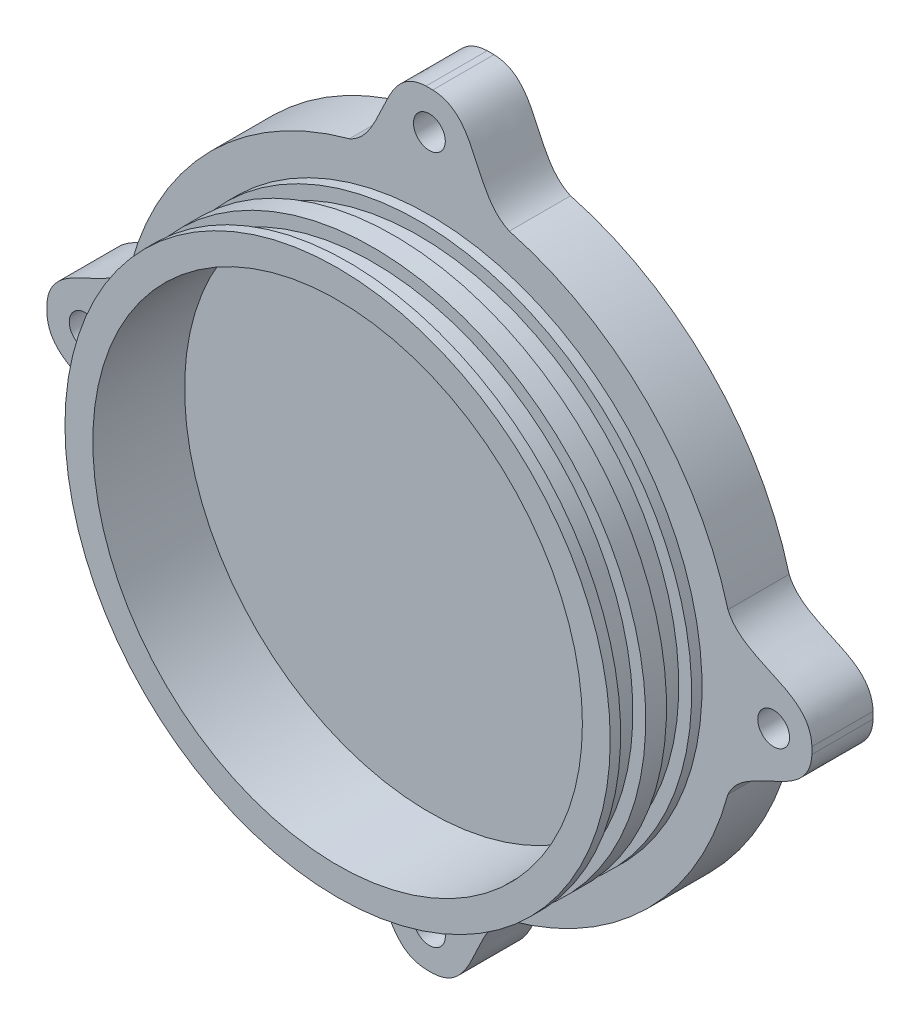
ISO-10303-21;
HEADER;
FILE_DESCRIPTION(('STEP AP214'),'2;1');
FILE_NAME('part.step','',(''),(''),'','','');
FILE_SCHEMA(('AUTOMOTIVE_DESIGN { 1 0 10303 214 1 1 1 1 }'));
ENDSEC;
DATA;
#1=APPLICATION_CONTEXT('core data for automotive mechanical design processes');
#2=APPLICATION_PROTOCOL_DEFINITION('international standard','automotive_design',2000,#1);
#3=PRODUCT_CONTEXT('',#1,'mechanical');
#4=PRODUCT('Part','Part','',(#3));
#5=PRODUCT_RELATED_PRODUCT_CATEGORY('part','',(#4));
#6=PRODUCT_DEFINITION_FORMATION('','',#4);
#7=PRODUCT_DEFINITION_CONTEXT('part definition',#1,'design');
#8=PRODUCT_DEFINITION('design','',#6,#7);
#9=PRODUCT_DEFINITION_SHAPE('','',#8);
#10=(LENGTH_UNIT() NAMED_UNIT(*) SI_UNIT(.MILLI.,.METRE.));
#11=(NAMED_UNIT(*) PLANE_ANGLE_UNIT() SI_UNIT($,.RADIAN.));
#12=(NAMED_UNIT(*) SI_UNIT($,.STERADIAN.) SOLID_ANGLE_UNIT());
#13=UNCERTAINTY_MEASURE_WITH_UNIT(LENGTH_MEASURE(1.E-05),#10,'distance_accuracy_value','');
#14=(GEOMETRIC_REPRESENTATION_CONTEXT(3) GLOBAL_UNCERTAINTY_ASSIGNED_CONTEXT((#13)) GLOBAL_UNIT_ASSIGNED_CONTEXT((#10,
#11,#12)) REPRESENTATION_CONTEXT('',''));
#15=CARTESIAN_POINT('',(0.,0.,0.));
#16=DIRECTION('',(0.,0.,1.));
#17=DIRECTION('',(1.,0.,0.));
#18=AXIS2_PLACEMENT_3D('',#15,#16,#17);
#19=CARTESIAN_POINT('',(0.,0.,-10.));
#20=DIRECTION('',(0.,0.,1.));
#21=DIRECTION('',(1.,0.,0.));
#22=AXIS2_PLACEMENT_3D('',#19,#20,#21);
#23=CYLINDRICAL_SURFACE('',#22,62.5);
#24=DIRECTION('',(0.,0.,1.));
#25=VECTOR('',#24,1.);
#26=CARTESIAN_POINT('',(0.554611570234708,-62.497539199605,-10.));
#27=LINE('',#26,#25);
#28=CARTESIAN_POINT('',(0.554611570234708,-62.497539199605,-10.));
#29=VERTEX_POINT('',#28);
#30=CARTESIAN_POINT('',(0.554611570234708,-62.497539199605,0.));
#31=VERTEX_POINT('',#30);
#32=EDGE_CURVE('E152',#29,#31,#27,.T.);
#33=ORIENTED_EDGE('',*,*,#32,.T.);
#34=CARTESIAN_POINT('',(0.,0.,0.));
#35=DIRECTION('',(0.,0.,-1.));
#36=DIRECTION('',(-1.,0.,0.));
#37=AXIS2_PLACEMENT_3D('',#34,#35,#36);
#38=CIRCLE('',#37,62.5);
#39=CARTESIAN_POINT('',(-0.554611570234827,-62.497539199605,0.));
#40=VERTEX_POINT('',#39);
#41=EDGE_CURVE('E190',#31,#40,#38,.T.);
#42=ORIENTED_EDGE('',*,*,#41,.T.);
#43=DIRECTION('',(0.,0.,1.));
#44=VECTOR('',#43,1.);
#45=CARTESIAN_POINT('',(-0.554611570234827,-62.497539199605,-10.));
#46=LINE('',#45,#44);
#47=CARTESIAN_POINT('',(-0.554611570234827,-62.497539199605,-10.));
#48=VERTEX_POINT('',#47);
#49=EDGE_CURVE('E61',#48,#40,#46,.T.);
#50=ORIENTED_EDGE('',*,*,#49,.F.);
#51=CARTESIAN_POINT('',(0.,0.,-10.));
#52=DIRECTION('',(0.,0.,-1.));
#53=DIRECTION('',(-1.,0.,0.));
#54=AXIS2_PLACEMENT_3D('',#51,#52,#53);
#55=CIRCLE('',#54,62.5);
#56=EDGE_CURVE('E172',#29,#48,#55,.T.);
#57=ORIENTED_EDGE('',*,*,#56,.F.);
#58=EDGE_LOOP('',(#33,#42,#50,#57));
#59=FACE_BOUND('',#58,.T.);
#60=ADVANCED_FACE('F36',(#59),#23,.T.);
#61=DIRECTION('',(0.,0.,1.));
#62=VECTOR('',#61,1.);
#63=CARTESIAN_POINT('',(-62.497539199605,-0.554611570234899,-10.));
#64=LINE('',#63,#62);
#65=CARTESIAN_POINT('',(-62.497539199605,-0.554611570234899,-10.));
#66=VERTEX_POINT('',#65);
#67=CARTESIAN_POINT('',(-62.497539199605,-0.554611570234899,0.));
#68=VERTEX_POINT('',#67);
#69=EDGE_CURVE('E742',#66,#68,#64,.T.);
#70=ORIENTED_EDGE('',*,*,#69,.T.);
#71=CARTESIAN_POINT('',(-62.497539199605,0.554611570235492,0.));
#72=VERTEX_POINT('',#71);
#73=EDGE_CURVE('E250',#68,#72,#38,.T.);
#74=ORIENTED_EDGE('',*,*,#73,.T.);
#75=DIRECTION('',(0.,0.,1.));
#76=VECTOR('',#75,1.);
#77=CARTESIAN_POINT('',(-62.497539199605,0.554611570235492,-10.));
#78=LINE('',#77,#76);
#79=CARTESIAN_POINT('',(-62.497539199605,0.554611570235492,-10.));
#80=VERTEX_POINT('',#79);
#81=EDGE_CURVE('E53',#80,#72,#78,.T.);
#82=ORIENTED_EDGE('',*,*,#81,.F.);
#83=EDGE_CURVE('E178',#66,#80,#55,.T.);
#84=ORIENTED_EDGE('',*,*,#83,.F.);
#85=EDGE_LOOP('',(#70,#74,#82,#84));
#86=FACE_BOUND('',#85,.T.);
#87=ADVANCED_FACE('F280',(#86),#23,.T.);
#88=DIRECTION('',(0.,0.,1.));
#89=VECTOR('',#88,1.);
#90=CARTESIAN_POINT('',(-0.554611570233609,62.497539199605,-10.));
#91=LINE('',#90,#89);
#92=CARTESIAN_POINT('',(-0.554611570233609,62.497539199605,-10.));
#93=VERTEX_POINT('',#92);
#94=CARTESIAN_POINT('',(-0.554611570233609,62.497539199605,0.));
#95=VERTEX_POINT('',#94);
#96=EDGE_CURVE('E304',#93,#95,#91,.T.);
#97=ORIENTED_EDGE('',*,*,#96,.T.);
#98=CARTESIAN_POINT('',(0.554611570235184,62.497539199605,0.));
#99=VERTEX_POINT('',#98);
#100=EDGE_CURVE('E191',#95,#99,#38,.T.);
#101=ORIENTED_EDGE('',*,*,#100,.T.);
#102=DIRECTION('',(0.,0.,1.));
#103=VECTOR('',#102,1.);
#104=CARTESIAN_POINT('',(0.554611570235183,62.497539199605,-10.));
#105=LINE('',#104,#103);
#106=CARTESIAN_POINT('',(0.554611570235183,62.497539199605,-10.));
#107=VERTEX_POINT('',#106);
#108=EDGE_CURVE('E217',#107,#99,#105,.T.);
#109=ORIENTED_EDGE('',*,*,#108,.F.);
#110=EDGE_CURVE('E181',#93,#107,#55,.T.);
#111=ORIENTED_EDGE('',*,*,#110,.F.);
#112=EDGE_LOOP('',(#97,#101,#109,#111));
#113=FACE_BOUND('',#112,.T.);
#114=ADVANCED_FACE('F285',(#113),#23,.T.);
#115=CARTESIAN_POINT('',(0.,0.,-10.));
#116=DIRECTION('',(0.,0.,-1.));
#117=DIRECTION('',(-1.,0.,0.));
#118=AXIS2_PLACEMENT_3D('',#115,#116,#117);
#119=PLANE('',#118);
#120=CARTESIAN_POINT('',(56.25,0.,-10.));
#121=DIRECTION('',(0.,0.,-1.));
#122=DIRECTION('',(1.,0.,0.));
#123=AXIS2_PLACEMENT_3D('',#120,#121,#122);
#124=CIRCLE('',#123,2.59999999999999);
#125=CARTESIAN_POINT('',(58.85,0.,-10.));
#126=VERTEX_POINT('',#125);
#127=EDGE_CURVE('E204',#126,#126,#124,.T.);
#128=ORIENTED_EDGE('',*,*,#127,.F.);
#129=EDGE_LOOP('',(#128));
#130=FACE_BOUND('',#129,.T.);
#131=CARTESIAN_POINT('',(-5.89187475929779E-13,56.25,-10.));
#132=DIRECTION('',(0.,0.,-1.));
#133=DIRECTION('',(0.,1.,0.));
#134=AXIS2_PLACEMENT_3D('',#131,#132,#133);
#135=CIRCLE('',#134,2.59999999999999);
#136=CARTESIAN_POINT('',(-6.16421030372755E-13,58.85,-10.));
#137=VERTEX_POINT('',#136);
#138=EDGE_CURVE('E209',#137,#137,#135,.T.);
#139=ORIENTED_EDGE('',*,*,#138,.F.);
#140=EDGE_LOOP('',(#139));
#141=FACE_BOUND('',#140,.T.);
#142=CARTESIAN_POINT('',(1.96395825309926E-13,-56.25,-10.));
#143=DIRECTION('',(0.,0.,-1.));
#144=DIRECTION('',(0.,-1.,0.));
#145=AXIS2_PLACEMENT_3D('',#142,#143,#144);
#146=CIRCLE('',#145,2.59999999999999);
#147=CARTESIAN_POINT('',(2.05473676790918E-13,-58.85,-10.));
#148=VERTEX_POINT('',#147);
#149=EDGE_CURVE('E201',#148,#148,#146,.T.);
#150=ORIENTED_EDGE('',*,*,#149,.F.);
#151=EDGE_LOOP('',(#150));
#152=FACE_BOUND('',#151,.T.);
#153=CARTESIAN_POINT('',(-56.25,0.,-10.));
#154=DIRECTION('',(0.,0.,-1.));
#155=DIRECTION('',(-1.,0.,0.));
#156=AXIS2_PLACEMENT_3D('',#153,#154,#155);
#157=CIRCLE('',#156,2.59999999999999);
#158=CARTESIAN_POINT('',(-58.85,0.,-10.));
#159=VERTEX_POINT('',#158);
#160=EDGE_CURVE('E198',#159,#159,#157,.T.);
#161=ORIENTED_EDGE('',*,*,#160,.F.);
#162=EDGE_LOOP('',(#161));
#163=FACE_BOUND('',#162,.T.);
#164=CARTESIAN_POINT('',(0.,0.,-10.));
#165=DIRECTION('',(0.,0.,1.));
#166=DIRECTION('',(1.,0.,0.));
#167=AXIS2_PLACEMENT_3D('',#164,#165,#166);
#168=CIRCLE('',#167,50.5);
#169=CARTESIAN_POINT('',(13.0703617776772,-48.779254227598,-10.));
#170=VERTEX_POINT('',#169);
#171=CARTESIAN_POINT('',(48.7792542275979,-13.0703617776773,-10.));
#172=VERTEX_POINT('',#171);
#173=EDGE_CURVE('E165',#170,#172,#168,.T.);
#174=ORIENTED_EDGE('',*,*,#173,.F.);
#175=CARTESIAN_POINT('',(-2.11278689773789E-13,-62.5,-10.));
#176=CARTESIAN_POINT('',(8.1554231591671,-62.7288766127193,-10.));
#177=CARTESIAN_POINT('',(6.88965837095345,-51.4602334051738,-10.));
#178=CARTESIAN_POINT('',(13.0703617776772,-48.779254227598,-10.));
#179=B_SPLINE_CURVE_WITH_KNOTS('',3,(#175,#176,#177,#178),.UNSPECIFIED.,.F.,.F.,(4,4),(0.,1.),.UNSPECIFIED.);
#180=EDGE_CURVE('E156',#29,#170,#179,.T.);
#181=ORIENTED_EDGE('',*,*,#180,.F.);
#182=ORIENTED_EDGE('',*,*,#56,.T.);
#183=CARTESIAN_POINT('',(-2.11278689773789E-13,-62.5,-10.));
#184=CARTESIAN_POINT('',(-8.15542315916752,-62.7288766127193,-10.));
#185=CARTESIAN_POINT('',(-6.88965837095379,-51.4602334051738,-10.));
#186=CARTESIAN_POINT('',(-13.0703617776775,-48.7792542275979,-10.));
#187=B_SPLINE_CURVE_WITH_KNOTS('',3,(#183,#184,#185,#186),.UNSPECIFIED.,.F.,.F.,(4,4),(0.,1.),.UNSPECIFIED.);
#188=CARTESIAN_POINT('',(-13.0703617776775,-48.7792542275979,-10.));
#189=VERTEX_POINT('',#188);
#190=EDGE_CURVE('E688',#48,#189,#187,.T.);
#191=ORIENTED_EDGE('',*,*,#190,.T.);
#192=CARTESIAN_POINT('',(0.,0.,-10.));
#193=DIRECTION('',(0.,0.,1.));
#194=DIRECTION('',(1.,0.,0.));
#195=AXIS2_PLACEMENT_3D('',#192,#193,#194);
#196=CIRCLE('',#195,50.5);
#197=CARTESIAN_POINT('',(-48.779254227598,-13.070361777677,-10.));
#198=VERTEX_POINT('',#197);
#199=EDGE_CURVE('E761',#198,#189,#196,.T.);
#200=ORIENTED_EDGE('',*,*,#199,.F.);
#201=CARTESIAN_POINT('',(-62.5,4.36435167355392E-13,-10.));
#202=CARTESIAN_POINT('',(-62.7288766127194,-8.15542315916688,-10.));
#203=CARTESIAN_POINT('',(-51.4602334051738,-6.88965837095326,-10.));
#204=CARTESIAN_POINT('',(-48.7792542275981,-13.070361777677,-10.));
#205=B_SPLINE_CURVE_WITH_KNOTS('',3,(#201,#202,#203,#204),.UNSPECIFIED.,.F.,.F.,(4,4),(0.,1.),.UNSPECIFIED.);
#206=EDGE_CURVE('E683',#66,#198,#205,.T.);
#207=ORIENTED_EDGE('',*,*,#206,.F.);
#208=ORIENTED_EDGE('',*,*,#83,.T.);
#209=CARTESIAN_POINT('',(-62.5,4.36435167355392E-13,-10.));
#210=CARTESIAN_POINT('',(-62.7288766127192,8.15542315916775,-10.));
#211=CARTESIAN_POINT('',(-51.4602334051738,6.88965837095398,-10.));
#212=CARTESIAN_POINT('',(-48.7792542275979,13.0703617776777,-10.));
#213=B_SPLINE_CURVE_WITH_KNOTS('',3,(#209,#210,#211,#212),.UNSPECIFIED.,.F.,.F.,(4,4),(0.,1.),.UNSPECIFIED.);
#214=CARTESIAN_POINT('',(-48.7792542275979,13.0703617776777,-10.));
#215=VERTEX_POINT('',#214);
#216=EDGE_CURVE('E699',#80,#215,#213,.T.);
#217=ORIENTED_EDGE('',*,*,#216,.T.);
#218=CARTESIAN_POINT('',(0.,0.,-10.));
#219=DIRECTION('',(0.,0.,1.));
#220=DIRECTION('',(1.,0.,0.));
#221=AXIS2_PLACEMENT_3D('',#218,#219,#220);
#222=CIRCLE('',#221,50.5);
#223=CARTESIAN_POINT('',(-13.0703617776768,48.7792542275981,-10.));
#224=VERTEX_POINT('',#223);
#225=EDGE_CURVE('E310',#224,#215,#222,.T.);
#226=ORIENTED_EDGE('',*,*,#225,.F.);
#227=CARTESIAN_POINT('',(6.61591644936995E-13,62.5,-10.));
#228=CARTESIAN_POINT('',(-8.15542315916665,62.7288766127194,-10.));
#229=CARTESIAN_POINT('',(-6.88965837095307,51.4602334051739,-10.));
#230=CARTESIAN_POINT('',(-13.0703617776768,48.7792542275981,-10.));
#231=B_SPLINE_CURVE_WITH_KNOTS('',3,(#227,#228,#229,#230),.UNSPECIFIED.,.F.,.F.,(4,4),(0.,1.),.UNSPECIFIED.);
#232=EDGE_CURVE('E705',#93,#224,#231,.T.);
#233=ORIENTED_EDGE('',*,*,#232,.F.);
#234=ORIENTED_EDGE('',*,*,#110,.T.);
#235=CARTESIAN_POINT('',(6.61591644936995E-13,62.5,-10.));
#236=CARTESIAN_POINT('',(8.15542315916798,62.7288766127192,-10.));
#237=CARTESIAN_POINT('',(6.88965837095416,51.4602334051737,-10.));
#238=CARTESIAN_POINT('',(13.0703617776779,48.7792542275978,-10.));
#239=B_SPLINE_CURVE_WITH_KNOTS('',3,(#235,#236,#237,#238),.UNSPECIFIED.,.F.,.F.,(4,4),(0.,1.),.UNSPECIFIED.);
#240=CARTESIAN_POINT('',(13.0703617776779,48.7792542275978,-10.));
#241=VERTEX_POINT('',#240);
#242=EDGE_CURVE('E346',#107,#241,#239,.T.);
#243=ORIENTED_EDGE('',*,*,#242,.T.);
#244=CARTESIAN_POINT('',(0.,0.,-10.));
#245=DIRECTION('',(0.,0.,1.));
#246=DIRECTION('',(1.,0.,0.));
#247=AXIS2_PLACEMENT_3D('',#244,#245,#246);
#248=CIRCLE('',#247,50.5);
#249=CARTESIAN_POINT('',(48.7792542275979,13.0703617776773,-10.));
#250=VERTEX_POINT('',#249);
#251=EDGE_CURVE('E356',#250,#241,#248,.T.);
#252=ORIENTED_EDGE('',*,*,#251,.F.);
#253=CARTESIAN_POINT('',(62.5,0.,-10.));
#254=CARTESIAN_POINT('',(62.7288766127193,8.15542315916732,-10.));
#255=CARTESIAN_POINT('',(51.4602334051738,6.88965837095362,-10.));
#256=CARTESIAN_POINT('',(48.7792542275979,13.0703617776773,-10.));
#257=B_SPLINE_CURVE_WITH_KNOTS('',3,(#253,#254,#255,#256),.UNSPECIFIED.,.F.,.F.,(4,4),(0.,1.),.UNSPECIFIED.);
#258=CARTESIAN_POINT('',(62.497539199605,0.554611570234859,-10.));
#259=VERTEX_POINT('',#258);
#260=EDGE_CURVE('E334',#259,#250,#257,.T.);
#261=ORIENTED_EDGE('',*,*,#260,.F.);
#262=CARTESIAN_POINT('',(62.497539199605,-0.554611570234518,-10.));
#263=VERTEX_POINT('',#262);
#264=EDGE_CURVE('E177',#259,#263,#55,.T.);
#265=ORIENTED_EDGE('',*,*,#264,.T.);
#266=CARTESIAN_POINT('',(62.5,0.,-10.));
#267=CARTESIAN_POINT('',(62.7288766127193,-8.15542315916732,-10.));
#268=CARTESIAN_POINT('',(51.4602334051738,-6.88965837095362,-10.));
#269=CARTESIAN_POINT('',(48.7792542275979,-13.0703617776773,-10.));
#270=B_SPLINE_CURVE_WITH_KNOTS('',3,(#266,#267,#268,#269),.UNSPECIFIED.,.F.,.F.,(4,4),(0.,1.),.UNSPECIFIED.);
#271=EDGE_CURVE('E174',#263,#172,#270,.T.);
#272=ORIENTED_EDGE('',*,*,#271,.T.);
#273=EDGE_LOOP('',(#174,#181,#182,#191,#200,#207,#208,#217,#226,#233,#234,#243,#252,#261,#265,#272));
#274=FACE_BOUND('',#273,.T.);
#275=ADVANCED_FACE('F170',(#130,#141,#152,#163,#274),#119,.T.);
#276=CARTESIAN_POINT('',(0.,0.,0.));
#277=DIRECTION('',(0.,0.,-1.));
#278=DIRECTION('',(-1.,0.,0.));
#279=AXIS2_PLACEMENT_3D('',#276,#277,#278);
#280=PLANE('',#279);
#281=CARTESIAN_POINT('',(56.25,0.,0.));
#282=DIRECTION('',(0.,0.,-1.));
#283=DIRECTION('',(-1.,0.,0.));
#284=AXIS2_PLACEMENT_3D('',#281,#282,#283);
#285=CIRCLE('',#284,2.59999999999999);
#286=CARTESIAN_POINT('',(53.65,0.,0.));
#287=VERTEX_POINT('',#286);
#288=EDGE_CURVE('E40',#287,#287,#285,.T.);
#289=ORIENTED_EDGE('',*,*,#288,.T.);
#290=EDGE_LOOP('',(#289));
#291=FACE_BOUND('',#290,.T.);
#292=CARTESIAN_POINT('',(-5.89187475929779E-13,56.25,0.));
#293=DIRECTION('',(0.,0.,-1.));
#294=DIRECTION('',(-1.,0.,0.));
#295=AXIS2_PLACEMENT_3D('',#292,#293,#294);
#296=CIRCLE('',#295,2.59999999999999);
#297=CARTESIAN_POINT('',(-2.60000000000058,56.25,0.));
#298=VERTEX_POINT('',#297);
#299=EDGE_CURVE('E202',#298,#298,#296,.T.);
#300=ORIENTED_EDGE('',*,*,#299,.T.);
#301=EDGE_LOOP('',(#300));
#302=FACE_BOUND('',#301,.T.);
#303=CARTESIAN_POINT('',(1.96395825309926E-13,-56.25,0.));
#304=DIRECTION('',(0.,0.,-1.));
#305=DIRECTION('',(-1.,0.,0.));
#306=AXIS2_PLACEMENT_3D('',#303,#304,#305);
#307=CIRCLE('',#306,2.59999999999999);
#308=CARTESIAN_POINT('',(-2.59999999999979,-56.25,0.));
#309=VERTEX_POINT('',#308);
#310=EDGE_CURVE('E199',#309,#309,#307,.T.);
#311=ORIENTED_EDGE('',*,*,#310,.T.);
#312=EDGE_LOOP('',(#311));
#313=FACE_BOUND('',#312,.T.);
#314=CARTESIAN_POINT('',(-56.25,0.,0.));
#315=DIRECTION('',(0.,0.,-1.));
#316=DIRECTION('',(-1.,0.,0.));
#317=AXIS2_PLACEMENT_3D('',#314,#315,#316);
#318=CIRCLE('',#317,2.59999999999999);
#319=CARTESIAN_POINT('',(-58.85,0.,0.));
#320=VERTEX_POINT('',#319);
#321=EDGE_CURVE('E194',#320,#320,#318,.T.);
#322=ORIENTED_EDGE('',*,*,#321,.T.);
#323=EDGE_LOOP('',(#322));
#324=FACE_BOUND('',#323,.T.);
#325=CARTESIAN_POINT('',(0.,0.,0.));
#326=DIRECTION('',(0.,0.,-1.));
#327=DIRECTION('',(-1.,0.,0.));
#328=AXIS2_PLACEMENT_3D('',#325,#326,#327);
#329=CIRCLE('',#328,44.55);
#330=CARTESIAN_POINT('',(-44.55,0.,0.));
#331=VERTEX_POINT('',#330);
#332=EDGE_CURVE('E45',#331,#331,#329,.T.);
#333=ORIENTED_EDGE('',*,*,#332,.T.);
#334=EDGE_LOOP('',(#333));
#335=FACE_BOUND('',#334,.T.);
#336=CARTESIAN_POINT('',(-2.11278689773789E-13,-62.5,0.));
#337=CARTESIAN_POINT('',(8.1554231591671,-62.7288766127193,0.));
#338=CARTESIAN_POINT('',(6.88965837095345,-51.4602334051738,0.));
#339=CARTESIAN_POINT('',(13.0703617776772,-48.779254227598,0.));
#340=B_SPLINE_CURVE_WITH_KNOTS('',3,(#336,#337,#338,#339),.UNSPECIFIED.,.F.,.F.,(4,4),(0.,1.),.UNSPECIFIED.);
#341=CARTESIAN_POINT('',(13.0703617776772,-48.779254227598,0.));
#342=VERTEX_POINT('',#341);
#343=EDGE_CURVE('E159',#31,#342,#340,.T.);
#344=ORIENTED_EDGE('',*,*,#343,.T.);
#345=CARTESIAN_POINT('',(0.,0.,0.));
#346=DIRECTION('',(0.,0.,1.));
#347=DIRECTION('',(1.,0.,0.));
#348=AXIS2_PLACEMENT_3D('',#345,#346,#347);
#349=CIRCLE('',#348,50.5);
#350=CARTESIAN_POINT('',(48.7792542275979,-13.0703617776773,0.));
#351=VERTEX_POINT('',#350);
#352=EDGE_CURVE('E175',#342,#351,#349,.T.);
#353=ORIENTED_EDGE('',*,*,#352,.T.);
#354=CARTESIAN_POINT('',(62.5,0.,0.));
#355=CARTESIAN_POINT('',(62.7288766127193,-8.15542315916732,0.));
#356=CARTESIAN_POINT('',(51.4602334051738,-6.88965837095362,0.));
#357=CARTESIAN_POINT('',(48.7792542275979,-13.0703617776773,0.));
#358=B_SPLINE_CURVE_WITH_KNOTS('',3,(#354,#355,#356,#357),.UNSPECIFIED.,.F.,.F.,(4,4),(0.,1.),.UNSPECIFIED.);
#359=CARTESIAN_POINT('',(62.497539199605,-0.554611570234518,0.));
#360=VERTEX_POINT('',#359);
#361=EDGE_CURVE('E668',#360,#351,#358,.T.);
#362=ORIENTED_EDGE('',*,*,#361,.F.);
#363=CARTESIAN_POINT('',(62.497539199605,0.554611570234859,0.));
#364=VERTEX_POINT('',#363);
#365=EDGE_CURVE('E187',#364,#360,#38,.T.);
#366=ORIENTED_EDGE('',*,*,#365,.F.);
#367=CARTESIAN_POINT('',(62.5,0.,0.));
#368=CARTESIAN_POINT('',(62.7288766127193,8.15542315916732,0.));
#369=CARTESIAN_POINT('',(51.4602334051738,6.88965837095362,0.));
#370=CARTESIAN_POINT('',(48.7792542275979,13.0703617776773,0.));
#371=B_SPLINE_CURVE_WITH_KNOTS('',3,(#367,#368,#369,#370),.UNSPECIFIED.,.F.,.F.,(4,4),(0.,1.),.UNSPECIFIED.);
#372=CARTESIAN_POINT('',(48.7792542275979,13.0703617776773,0.));
#373=VERTEX_POINT('',#372);
#374=EDGE_CURVE('E327',#364,#373,#371,.T.);
#375=ORIENTED_EDGE('',*,*,#374,.T.);
#376=CARTESIAN_POINT('',(0.,0.,0.));
#377=DIRECTION('',(0.,0.,1.));
#378=DIRECTION('',(1.,0.,0.));
#379=AXIS2_PLACEMENT_3D('',#376,#377,#378);
#380=CIRCLE('',#379,50.5);
#381=CARTESIAN_POINT('',(13.0703617776779,48.7792542275978,0.));
#382=VERTEX_POINT('',#381);
#383=EDGE_CURVE('E322',#373,#382,#380,.T.);
#384=ORIENTED_EDGE('',*,*,#383,.T.);
#385=CARTESIAN_POINT('',(6.61591644936995E-13,62.5,0.));
#386=CARTESIAN_POINT('',(8.15542315916798,62.7288766127192,0.));
#387=CARTESIAN_POINT('',(6.88965837095416,51.4602334051737,0.));
#388=CARTESIAN_POINT('',(13.0703617776779,48.7792542275978,0.));
#389=B_SPLINE_CURVE_WITH_KNOTS('',3,(#385,#386,#387,#388),.UNSPECIFIED.,.F.,.F.,(4,4),(0.,1.),.UNSPECIFIED.);
#390=EDGE_CURVE('E319',#99,#382,#389,.T.);
#391=ORIENTED_EDGE('',*,*,#390,.F.);
#392=ORIENTED_EDGE('',*,*,#100,.F.);
#393=CARTESIAN_POINT('',(6.61591644936995E-13,62.5,0.));
#394=CARTESIAN_POINT('',(-8.15542315916665,62.7288766127194,0.));
#395=CARTESIAN_POINT('',(-6.88965837095307,51.4602334051739,0.));
#396=CARTESIAN_POINT('',(-13.0703617776768,48.7792542275981,0.));
#397=B_SPLINE_CURVE_WITH_KNOTS('',3,(#393,#394,#395,#396),.UNSPECIFIED.,.F.,.F.,(4,4),(0.,1.),.UNSPECIFIED.);
#398=CARTESIAN_POINT('',(-13.0703617776768,48.7792542275981,0.));
#399=VERTEX_POINT('',#398);
#400=EDGE_CURVE('E316',#95,#399,#397,.T.);
#401=ORIENTED_EDGE('',*,*,#400,.T.);
#402=CARTESIAN_POINT('',(0.,0.,0.));
#403=DIRECTION('',(0.,0.,1.));
#404=DIRECTION('',(1.,0.,0.));
#405=AXIS2_PLACEMENT_3D('',#402,#403,#404);
#406=CIRCLE('',#405,50.5);
#407=CARTESIAN_POINT('',(-48.7792542275979,13.0703617776777,0.));
#408=VERTEX_POINT('',#407);
#409=EDGE_CURVE('E724',#399,#408,#406,.T.);
#410=ORIENTED_EDGE('',*,*,#409,.T.);
#411=CARTESIAN_POINT('',(-62.5,4.36435167355392E-13,0.));
#412=CARTESIAN_POINT('',(-62.7288766127192,8.15542315916775,0.));
#413=CARTESIAN_POINT('',(-51.4602334051738,6.88965837095398,0.));
#414=CARTESIAN_POINT('',(-48.7792542275979,13.0703617776777,0.));
#415=B_SPLINE_CURVE_WITH_KNOTS('',3,(#411,#412,#413,#414),.UNSPECIFIED.,.F.,.F.,(4,4),(0.,1.),.UNSPECIFIED.);
#416=EDGE_CURVE('E717',#72,#408,#415,.T.);
#417=ORIENTED_EDGE('',*,*,#416,.F.);
#418=ORIENTED_EDGE('',*,*,#73,.F.);
#419=CARTESIAN_POINT('',(-62.5,4.36435167355392E-13,0.));
#420=CARTESIAN_POINT('',(-62.7288766127194,-8.15542315916688,0.));
#421=CARTESIAN_POINT('',(-51.4602334051738,-6.88965837095326,0.));
#422=CARTESIAN_POINT('',(-48.7792542275981,-13.070361777677,0.));
#423=B_SPLINE_CURVE_WITH_KNOTS('',3,(#419,#420,#421,#422),.UNSPECIFIED.,.F.,.F.,(4,4),(0.,1.),.UNSPECIFIED.);
#424=CARTESIAN_POINT('',(-48.779254227598,-13.070361777677,0.));
#425=VERTEX_POINT('',#424);
#426=EDGE_CURVE('E732',#68,#425,#423,.T.);
#427=ORIENTED_EDGE('',*,*,#426,.T.);
#428=CARTESIAN_POINT('',(0.,0.,0.));
#429=DIRECTION('',(0.,0.,1.));
#430=DIRECTION('',(1.,0.,0.));
#431=AXIS2_PLACEMENT_3D('',#428,#429,#430);
#432=CIRCLE('',#431,50.5);
#433=CARTESIAN_POINT('',(-13.0703617776775,-48.7792542275979,0.));
#434=VERTEX_POINT('',#433);
#435=EDGE_CURVE('E689',#425,#434,#432,.T.);
#436=ORIENTED_EDGE('',*,*,#435,.T.);
#437=CARTESIAN_POINT('',(-2.11278689773789E-13,-62.5,0.));
#438=CARTESIAN_POINT('',(-8.15542315916752,-62.7288766127193,0.));
#439=CARTESIAN_POINT('',(-6.88965837095379,-51.4602334051738,0.));
#440=CARTESIAN_POINT('',(-13.0703617776775,-48.7792542275979,0.));
#441=B_SPLINE_CURVE_WITH_KNOTS('',3,(#437,#438,#439,#440),.UNSPECIFIED.,.F.,.F.,(4,4),(0.,1.),.UNSPECIFIED.);
#442=EDGE_CURVE('E744',#40,#434,#441,.T.);
#443=ORIENTED_EDGE('',*,*,#442,.F.);
#444=ORIENTED_EDGE('',*,*,#41,.F.);
#445=EDGE_LOOP('',(#344,#353,#362,#366,#375,#384,#391,#392,#401,#410,#417,#418,#427,#436,#443,#444));
#446=FACE_BOUND('',#445,.T.);
#447=ADVANCED_FACE('F289',(#291,#302,#313,#324,#335,#446),#280,.F.);
#448=ORIENTED_EDGE('',*,*,#365,.T.);
#449=DIRECTION('',(0.,0.,1.));
#450=VECTOR('',#449,1.);
#451=CARTESIAN_POINT('',(62.497539199605,-0.554611570234518,-10.));
#452=LINE('',#451,#450);
#453=EDGE_CURVE('E164',#263,#360,#452,.T.);
#454=ORIENTED_EDGE('',*,*,#453,.F.);
#455=ORIENTED_EDGE('',*,*,#264,.F.);
#456=DIRECTION('',(0.,0.,1.));
#457=VECTOR('',#456,1.);
#458=CARTESIAN_POINT('',(62.497539199605,0.554611570234859,-10.));
#459=LINE('',#458,#457);
#460=EDGE_CURVE('E214',#259,#364,#459,.T.);
#461=ORIENTED_EDGE('',*,*,#460,.T.);
#462=EDGE_LOOP('',(#448,#454,#455,#461));
#463=FACE_BOUND('',#462,.T.);
#464=ADVANCED_FACE('F274',(#463),#23,.T.);
#465=CARTESIAN_POINT('',(0.,0.,15.));
#466=DIRECTION('',(0.,0.,-1.));
#467=DIRECTION('',(-1.,0.,0.));
#468=AXIS2_PLACEMENT_3D('',#465,#466,#467);
#469=CYLINDRICAL_SURFACE('',#468,44.55);
#470=CARTESIAN_POINT('',(0.,0.,9.19999999999999));
#471=DIRECTION('',(0.,0.,-1.));
#472=DIRECTION('',(-1.,0.,0.));
#473=AXIS2_PLACEMENT_3D('',#470,#471,#472);
#474=CIRCLE('',#473,44.55);
#475=CARTESIAN_POINT('',(-44.55,0.,9.19999999999999));
#476=VERTEX_POINT('',#475);
#477=EDGE_CURVE('E232',#476,#476,#474,.T.);
#478=ORIENTED_EDGE('',*,*,#477,.T.);
#479=EDGE_LOOP('',(#478));
#480=FACE_BOUND('',#479,.T.);
#481=CARTESIAN_POINT('',(0.,0.,5.8));
#482=DIRECTION('',(0.,0.,-1.));
#483=DIRECTION('',(-1.,0.,0.));
#484=AXIS2_PLACEMENT_3D('',#481,#482,#483);
#485=CIRCLE('',#484,44.55);
#486=CARTESIAN_POINT('',(-44.55,0.,5.8));
#487=VERTEX_POINT('',#486);
#488=EDGE_CURVE('E238',#487,#487,#485,.T.);
#489=ORIENTED_EDGE('',*,*,#488,.F.);
#490=EDGE_LOOP('',(#489));
#491=FACE_BOUND('',#490,.T.);
#492=ADVANCED_FACE('F264',(#480,#491),#469,.T.);
#493=CARTESIAN_POINT('',(0.,0.,1.7));
#494=DIRECTION('',(0.,0.,-1.));
#495=DIRECTION('',(-1.,0.,0.));
#496=AXIS2_PLACEMENT_3D('',#493,#494,#495);
#497=CIRCLE('',#496,44.55);
#498=CARTESIAN_POINT('',(-44.55,0.,1.7));
#499=VERTEX_POINT('',#498);
#500=EDGE_CURVE('E235',#499,#499,#497,.T.);
#501=ORIENTED_EDGE('',*,*,#500,.T.);
#502=EDGE_LOOP('',(#501));
#503=FACE_BOUND('',#502,.T.);
#504=ORIENTED_EDGE('',*,*,#332,.F.);
#505=EDGE_LOOP('',(#504));
#506=FACE_BOUND('',#505,.T.);
#507=ADVANCED_FACE('F265',(#503,#506),#469,.T.);
#508=CARTESIAN_POINT('',(0.,42.45,1.7));
#509=DIRECTION('',(0.,0.,-1.));
#510=DIRECTION('',(-1.,0.,0.));
#511=AXIS2_PLACEMENT_3D('',#508,#509,#510);
#512=PLANE('',#511);
#513=ORIENTED_EDGE('',*,*,#500,.F.);
#514=EDGE_LOOP('',(#513));
#515=FACE_BOUND('',#514,.T.);
#516=CARTESIAN_POINT('',(0.,0.,1.7));
#517=DIRECTION('',(0.,0.,-1.));
#518=DIRECTION('',(-1.,0.,0.));
#519=AXIS2_PLACEMENT_3D('',#516,#517,#518);
#520=CIRCLE('',#519,42.45);
#521=CARTESIAN_POINT('',(-42.45,0.,1.7));
#522=VERTEX_POINT('',#521);
#523=EDGE_CURVE('E244',#522,#522,#520,.T.);
#524=ORIENTED_EDGE('',*,*,#523,.T.);
#525=EDGE_LOOP('',(#524));
#526=FACE_BOUND('',#525,.T.);
#527=ADVANCED_FACE('F277',(#515,#526),#512,.F.);
#528=CARTESIAN_POINT('',(0.,0.,-42.713110189006));
#529=DIRECTION('',(0.,0.,-1.));
#530=DIRECTION('',(-1.,0.,0.));
#531=AXIS2_PLACEMENT_3D('',#528,#529,#530);
#532=CYLINDRICAL_SURFACE('',#531,42.45);
#533=ORIENTED_EDGE('',*,*,#523,.F.);
#534=EDGE_LOOP('',(#533));
#535=FACE_BOUND('',#534,.T.);
#536=CARTESIAN_POINT('',(0.,0.,5.8));
#537=DIRECTION('',(0.,0.,-1.));
#538=DIRECTION('',(-1.,0.,0.));
#539=AXIS2_PLACEMENT_3D('',#536,#537,#538);
#540=CIRCLE('',#539,42.45);
#541=CARTESIAN_POINT('',(-42.45,0.,5.8));
#542=VERTEX_POINT('',#541);
#543=EDGE_CURVE('E241',#542,#542,#540,.T.);
#544=ORIENTED_EDGE('',*,*,#543,.T.);
#545=EDGE_LOOP('',(#544));
#546=FACE_BOUND('',#545,.T.);
#547=ADVANCED_FACE('F405',(#535,#546),#532,.T.);
#548=CARTESIAN_POINT('',(0.,42.45,5.8));
#549=DIRECTION('',(0.,0.,1.));
#550=DIRECTION('',(1.,0.,0.));
#551=AXIS2_PLACEMENT_3D('',#548,#549,#550);
#552=PLANE('',#551);
#553=ORIENTED_EDGE('',*,*,#543,.F.);
#554=EDGE_LOOP('',(#553));
#555=FACE_BOUND('',#554,.T.);
#556=ORIENTED_EDGE('',*,*,#488,.T.);
#557=EDGE_LOOP('',(#556));
#558=FACE_BOUND('',#557,.T.);
#559=ADVANCED_FACE('F401',(#555,#558),#552,.F.);
#560=CARTESIAN_POINT('',(0.,42.45,9.19999999999999));
#561=DIRECTION('',(0.,0.,-1.));
#562=DIRECTION('',(-1.,0.,0.));
#563=AXIS2_PLACEMENT_3D('',#560,#561,#562);
#564=PLANE('',#563);
#565=ORIENTED_EDGE('',*,*,#477,.F.);
#566=EDGE_LOOP('',(#565));
#567=FACE_BOUND('',#566,.T.);
#568=CARTESIAN_POINT('',(0.,0.,9.19999999999999));
#569=DIRECTION('',(0.,0.,-1.));
#570=DIRECTION('',(-1.,0.,0.));
#571=AXIS2_PLACEMENT_3D('',#568,#569,#570);
#572=CIRCLE('',#571,42.45);
#573=CARTESIAN_POINT('',(-42.45,0.,9.19999999999999));
#574=VERTEX_POINT('',#573);
#575=EDGE_CURVE('E197',#574,#574,#572,.T.);
#576=ORIENTED_EDGE('',*,*,#575,.T.);
#577=EDGE_LOOP('',(#576));
#578=FACE_BOUND('',#577,.T.);
#579=ADVANCED_FACE('F397',(#567,#578),#564,.F.);
#580=CARTESIAN_POINT('',(0.,42.45,13.3));
#581=DIRECTION('',(0.,0.,1.));
#582=DIRECTION('',(1.,0.,0.));
#583=AXIS2_PLACEMENT_3D('',#580,#581,#582);
#584=PLANE('',#583);
#585=CARTESIAN_POINT('',(0.,0.,13.3));
#586=DIRECTION('',(0.,0.,-1.));
#587=DIRECTION('',(-1.,0.,0.));
#588=AXIS2_PLACEMENT_3D('',#585,#586,#587);
#589=CIRCLE('',#588,42.45);
#590=CARTESIAN_POINT('',(-42.45,0.,13.3));
#591=VERTEX_POINT('',#590);
#592=EDGE_CURVE('E226',#591,#591,#589,.T.);
#593=ORIENTED_EDGE('',*,*,#592,.F.);
#594=EDGE_LOOP('',(#593));
#595=FACE_BOUND('',#594,.T.);
#596=CARTESIAN_POINT('',(0.,0.,13.3));
#597=DIRECTION('',(0.,0.,-1.));
#598=DIRECTION('',(-1.,0.,0.));
#599=AXIS2_PLACEMENT_3D('',#596,#597,#598);
#600=CIRCLE('',#599,44.55);
#601=CARTESIAN_POINT('',(-44.55,0.,13.3));
#602=VERTEX_POINT('',#601);
#603=EDGE_CURVE('E229',#602,#602,#600,.T.);
#604=ORIENTED_EDGE('',*,*,#603,.T.);
#605=EDGE_LOOP('',(#604));
#606=FACE_BOUND('',#605,.T.);
#607=ADVANCED_FACE('F393',(#595,#606),#584,.F.);
#608=CARTESIAN_POINT('',(0.,0.,-42.713110189006));
#609=DIRECTION('',(0.,0.,-1.));
#610=DIRECTION('',(-1.,0.,0.));
#611=AXIS2_PLACEMENT_3D('',#608,#609,#610);
#612=CYLINDRICAL_SURFACE('',#611,42.45);
#613=ORIENTED_EDGE('',*,*,#575,.F.);
#614=EDGE_LOOP('',(#613));
#615=FACE_BOUND('',#614,.T.);
#616=ORIENTED_EDGE('',*,*,#592,.T.);
#617=EDGE_LOOP('',(#616));
#618=FACE_BOUND('',#617,.T.);
#619=ADVANCED_FACE('F389',(#615,#618),#612,.T.);
#620=CARTESIAN_POINT('',(0.,0.,0.));
#621=DIRECTION('',(0.,0.,1.));
#622=DIRECTION('',(1.,0.,0.));
#623=AXIS2_PLACEMENT_3D('',#620,#621,#622);
#624=PLANE('',#623);
#625=CARTESIAN_POINT('',(0.,0.,0.));
#626=DIRECTION('',(0.,0.,1.));
#627=DIRECTION('',(1.,0.,0.));
#628=AXIS2_PLACEMENT_3D('',#625,#626,#627);
#629=CIRCLE('',#628,40.);
#630=CARTESIAN_POINT('',(40.,0.,0.));
#631=VERTEX_POINT('',#630);
#632=EDGE_CURVE('E246',#631,#631,#629,.T.);
#633=ORIENTED_EDGE('',*,*,#632,.T.);
#634=EDGE_LOOP('',(#633));
#635=FACE_BOUND('',#634,.T.);
#636=ADVANCED_FACE('F392',(#635),#624,.T.);
#637=CARTESIAN_POINT('',(0.,0.,0.));
#638=DIRECTION('',(0.,0.,1.));
#639=DIRECTION('',(1.,0.,0.));
#640=AXIS2_PLACEMENT_3D('',#637,#638,#639);
#641=CYLINDRICAL_SURFACE('',#640,40.);
#642=ORIENTED_EDGE('',*,*,#632,.F.);
#643=EDGE_LOOP('',(#642));
#644=FACE_BOUND('',#643,.T.);
#645=CARTESIAN_POINT('',(0.,0.,15.));
#646=DIRECTION('',(0.,0.,1.));
#647=DIRECTION('',(1.,0.,0.));
#648=AXIS2_PLACEMENT_3D('',#645,#646,#647);
#649=CIRCLE('',#648,40.);
#650=CARTESIAN_POINT('',(40.,0.,15.));
#651=VERTEX_POINT('',#650);
#652=EDGE_CURVE('E185',#651,#651,#649,.T.);
#653=ORIENTED_EDGE('',*,*,#652,.T.);
#654=EDGE_LOOP('',(#653));
#655=FACE_BOUND('',#654,.T.);
#656=ADVANCED_FACE('F254',(#644,#655),#641,.F.);
#657=CARTESIAN_POINT('',(0.,0.,15.));
#658=DIRECTION('',(0.,0.,1.));
#659=DIRECTION('',(1.,0.,0.));
#660=AXIS2_PLACEMENT_3D('',#657,#658,#659);
#661=PLANE('',#660);
#662=ORIENTED_EDGE('',*,*,#652,.F.);
#663=EDGE_LOOP('',(#662));
#664=FACE_BOUND('',#663,.T.);
#665=CARTESIAN_POINT('',(0.,0.,15.));
#666=DIRECTION('',(0.,0.,1.));
#667=DIRECTION('',(1.,0.,0.));
#668=AXIS2_PLACEMENT_3D('',#665,#666,#667);
#669=CIRCLE('',#668,44.55);
#670=CARTESIAN_POINT('',(44.55,0.,15.));
#671=VERTEX_POINT('',#670);
#672=EDGE_CURVE('E11',#671,#671,#669,.T.);
#673=ORIENTED_EDGE('',*,*,#672,.T.);
#674=EDGE_LOOP('',(#673));
#675=FACE_BOUND('',#674,.T.);
#676=ADVANCED_FACE('F256',(#664,#675),#661,.T.);
#677=ORIENTED_EDGE('',*,*,#603,.F.);
#678=EDGE_LOOP('',(#677));
#679=FACE_BOUND('',#678,.T.);
#680=ORIENTED_EDGE('',*,*,#672,.F.);
#681=EDGE_LOOP('',(#680));
#682=FACE_BOUND('',#681,.T.);
#683=ADVANCED_FACE('F38',(#679,#682),#469,.T.);
#684=CARTESIAN_POINT('',(-56.25,0.,15.));
#685=DIRECTION('',(0.,0.,-1.));
#686=DIRECTION('',(-1.,0.,0.));
#687=AXIS2_PLACEMENT_3D('',#684,#685,#686);
#688=CYLINDRICAL_SURFACE('',#687,2.59999999999999);
#689=ORIENTED_EDGE('',*,*,#160,.T.);
#690=EDGE_LOOP('',(#689));
#691=FACE_BOUND('',#690,.T.);
#692=ORIENTED_EDGE('',*,*,#321,.F.);
#693=EDGE_LOOP('',(#692));
#694=FACE_BOUND('',#693,.T.);
#695=ADVANCED_FACE('F262',(#691,#694),#688,.F.);
#696=CARTESIAN_POINT('',(1.96395825309926E-13,-56.25,15.));
#697=DIRECTION('',(0.,0.,-1.));
#698=DIRECTION('',(-1.,0.,0.));
#699=AXIS2_PLACEMENT_3D('',#696,#697,#698);
#700=CYLINDRICAL_SURFACE('',#699,2.59999999999999);
#701=ORIENTED_EDGE('',*,*,#149,.T.);
#702=EDGE_LOOP('',(#701));
#703=FACE_BOUND('',#702,.T.);
#704=ORIENTED_EDGE('',*,*,#310,.F.);
#705=EDGE_LOOP('',(#704));
#706=FACE_BOUND('',#705,.T.);
#707=ADVANCED_FACE('F269',(#703,#706),#700,.F.);
#708=CARTESIAN_POINT('',(-5.89187475929779E-13,56.25,15.));
#709=DIRECTION('',(0.,0.,-1.));
#710=DIRECTION('',(-1.,0.,0.));
#711=AXIS2_PLACEMENT_3D('',#708,#709,#710);
#712=CYLINDRICAL_SURFACE('',#711,2.59999999999999);
#713=ORIENTED_EDGE('',*,*,#138,.T.);
#714=EDGE_LOOP('',(#713));
#715=FACE_BOUND('',#714,.T.);
#716=ORIENTED_EDGE('',*,*,#299,.F.);
#717=EDGE_LOOP('',(#716));
#718=FACE_BOUND('',#717,.T.);
#719=ADVANCED_FACE('F382',(#715,#718),#712,.F.);
#720=CARTESIAN_POINT('',(56.25,0.,15.));
#721=DIRECTION('',(0.,0.,-1.));
#722=DIRECTION('',(-1.,0.,0.));
#723=AXIS2_PLACEMENT_3D('',#720,#721,#722);
#724=CYLINDRICAL_SURFACE('',#723,2.59999999999999);
#725=ORIENTED_EDGE('',*,*,#127,.T.);
#726=EDGE_LOOP('',(#725));
#727=FACE_BOUND('',#726,.T.);
#728=ORIENTED_EDGE('',*,*,#288,.F.);
#729=EDGE_LOOP('',(#728));
#730=FACE_BOUND('',#729,.T.);
#731=ADVANCED_FACE('F378',(#727,#730),#724,.F.);
#732=DIRECTION('',(0.,0.,1.));
#733=VECTOR('',#732,1.);
#734=SURFACE_OF_LINEAR_EXTRUSION('',#257,#733);
#735=ORIENTED_EDGE('',*,*,#374,.F.);
#736=ORIENTED_EDGE('',*,*,#460,.F.);
#737=ORIENTED_EDGE('',*,*,#260,.T.);
#738=DIRECTION('',(0.,0.,1.));
#739=VECTOR('',#738,1.);
#740=CARTESIAN_POINT('',(48.7792542275979,13.0703617776773,-10.));
#741=LINE('',#740,#739);
#742=EDGE_CURVE('E352',#250,#373,#741,.T.);
#743=ORIENTED_EDGE('',*,*,#742,.T.);
#744=EDGE_LOOP('',(#735,#736,#737,#743));
#745=FACE_BOUND('',#744,.T.);
#746=ADVANCED_FACE('F381',(#745),#734,.T.);
#747=CARTESIAN_POINT('',(0.,0.,-10.));
#748=DIRECTION('',(0.,0.,1.));
#749=DIRECTION('',(1.,0.,0.));
#750=AXIS2_PLACEMENT_3D('',#747,#748,#749);
#751=CYLINDRICAL_SURFACE('',#750,50.5);
#752=ORIENTED_EDGE('',*,*,#383,.F.);
#753=ORIENTED_EDGE('',*,*,#742,.F.);
#754=ORIENTED_EDGE('',*,*,#251,.T.);
#755=DIRECTION('',(0.,0.,1.));
#756=VECTOR('',#755,1.);
#757=CARTESIAN_POINT('',(13.0703617776779,48.7792542275978,-10.));
#758=LINE('',#757,#756);
#759=EDGE_CURVE('E353',#241,#382,#758,.T.);
#760=ORIENTED_EDGE('',*,*,#759,.T.);
#761=EDGE_LOOP('',(#752,#753,#754,#760));
#762=FACE_BOUND('',#761,.T.);
#763=ADVANCED_FACE('F376',(#762),#751,.T.);
#764=DIRECTION('',(0.,0.,1.));
#765=VECTOR('',#764,1.);
#766=SURFACE_OF_LINEAR_EXTRUSION('',#239,#765);
#767=ORIENTED_EDGE('',*,*,#390,.T.);
#768=ORIENTED_EDGE('',*,*,#759,.F.);
#769=ORIENTED_EDGE('',*,*,#242,.F.);
#770=ORIENTED_EDGE('',*,*,#108,.T.);
#771=EDGE_LOOP('',(#767,#768,#769,#770));
#772=FACE_BOUND('',#771,.T.);
#773=ADVANCED_FACE('F371',(#772),#766,.F.);
#774=DIRECTION('',(0.,0.,1.));
#775=VECTOR('',#774,1.);
#776=SURFACE_OF_LINEAR_EXTRUSION('',#231,#775);
#777=ORIENTED_EDGE('',*,*,#400,.F.);
#778=ORIENTED_EDGE('',*,*,#96,.F.);
#779=ORIENTED_EDGE('',*,*,#232,.T.);
#780=DIRECTION('',(0.,0.,1.));
#781=VECTOR('',#780,1.);
#782=CARTESIAN_POINT('',(-13.0703617776768,48.7792542275981,-10.));
#783=LINE('',#782,#781);
#784=EDGE_CURVE('E729',#224,#399,#783,.T.);
#785=ORIENTED_EDGE('',*,*,#784,.T.);
#786=EDGE_LOOP('',(#777,#778,#779,#785));
#787=FACE_BOUND('',#786,.T.);
#788=ADVANCED_FACE('F375',(#787),#776,.T.);
#789=CARTESIAN_POINT('',(0.,0.,-10.));
#790=DIRECTION('',(0.,0.,1.));
#791=DIRECTION('',(1.,0.,0.));
#792=AXIS2_PLACEMENT_3D('',#789,#790,#791);
#793=CYLINDRICAL_SURFACE('',#792,50.5);
#794=ORIENTED_EDGE('',*,*,#409,.F.);
#795=ORIENTED_EDGE('',*,*,#784,.F.);
#796=ORIENTED_EDGE('',*,*,#225,.T.);
#797=DIRECTION('',(0.,0.,1.));
#798=VECTOR('',#797,1.);
#799=CARTESIAN_POINT('',(-48.7792542275979,13.0703617776777,-10.));
#800=LINE('',#799,#798);
#801=EDGE_CURVE('E733',#215,#408,#800,.T.);
#802=ORIENTED_EDGE('',*,*,#801,.T.);
#803=EDGE_LOOP('',(#794,#795,#796,#802));
#804=FACE_BOUND('',#803,.T.);
#805=ADVANCED_FACE('F551',(#804),#793,.T.);
#806=DIRECTION('',(0.,0.,1.));
#807=VECTOR('',#806,1.);
#808=SURFACE_OF_LINEAR_EXTRUSION('',#213,#807);
#809=ORIENTED_EDGE('',*,*,#416,.T.);
#810=ORIENTED_EDGE('',*,*,#801,.F.);
#811=ORIENTED_EDGE('',*,*,#216,.F.);
#812=ORIENTED_EDGE('',*,*,#81,.T.);
#813=EDGE_LOOP('',(#809,#810,#811,#812));
#814=FACE_BOUND('',#813,.T.);
#815=ADVANCED_FACE('F559',(#814),#808,.F.);
#816=DIRECTION('',(0.,0.,1.));
#817=VECTOR('',#816,1.);
#818=SURFACE_OF_LINEAR_EXTRUSION('',#205,#817);
#819=ORIENTED_EDGE('',*,*,#426,.F.);
#820=ORIENTED_EDGE('',*,*,#69,.F.);
#821=ORIENTED_EDGE('',*,*,#206,.T.);
#822=DIRECTION('',(0.,0.,1.));
#823=VECTOR('',#822,1.);
#824=CARTESIAN_POINT('',(-48.779254227598,-13.070361777677,-10.));
#825=LINE('',#824,#823);
#826=EDGE_CURVE('E669',#198,#425,#825,.T.);
#827=ORIENTED_EDGE('',*,*,#826,.T.);
#828=EDGE_LOOP('',(#819,#820,#821,#827));
#829=FACE_BOUND('',#828,.T.);
#830=ADVANCED_FACE('F568',(#829),#818,.T.);
#831=CARTESIAN_POINT('',(0.,0.,-10.));
#832=DIRECTION('',(0.,0.,1.));
#833=DIRECTION('',(1.,0.,0.));
#834=AXIS2_PLACEMENT_3D('',#831,#832,#833);
#835=CYLINDRICAL_SURFACE('',#834,50.5);
#836=ORIENTED_EDGE('',*,*,#435,.F.);
#837=ORIENTED_EDGE('',*,*,#826,.F.);
#838=ORIENTED_EDGE('',*,*,#199,.T.);
#839=DIRECTION('',(0.,0.,1.));
#840=VECTOR('',#839,1.);
#841=CARTESIAN_POINT('',(-13.0703617776775,-48.7792542275979,-10.));
#842=LINE('',#841,#840);
#843=EDGE_CURVE('E759',#189,#434,#842,.T.);
#844=ORIENTED_EDGE('',*,*,#843,.T.);
#845=EDGE_LOOP('',(#836,#837,#838,#844));
#846=FACE_BOUND('',#845,.T.);
#847=ADVANCED_FACE('F576',(#846),#835,.T.);
#848=DIRECTION('',(0.,0.,1.));
#849=VECTOR('',#848,1.);
#850=SURFACE_OF_LINEAR_EXTRUSION('',#187,#849);
#851=ORIENTED_EDGE('',*,*,#442,.T.);
#852=ORIENTED_EDGE('',*,*,#843,.F.);
#853=ORIENTED_EDGE('',*,*,#190,.F.);
#854=ORIENTED_EDGE('',*,*,#49,.T.);
#855=EDGE_LOOP('',(#851,#852,#853,#854));
#856=FACE_BOUND('',#855,.T.);
#857=ADVANCED_FACE('F585',(#856),#850,.F.);
#858=DIRECTION('',(0.,0.,1.));
#859=VECTOR('',#858,1.);
#860=SURFACE_OF_LINEAR_EXTRUSION('',#179,#859);
#861=ORIENTED_EDGE('',*,*,#343,.F.);
#862=ORIENTED_EDGE('',*,*,#32,.F.);
#863=ORIENTED_EDGE('',*,*,#180,.T.);
#864=DIRECTION('',(0.,0.,1.));
#865=VECTOR('',#864,1.);
#866=CARTESIAN_POINT('',(13.0703617776772,-48.779254227598,-10.));
#867=LINE('',#866,#865);
#868=EDGE_CURVE('E325',#170,#342,#867,.T.);
#869=ORIENTED_EDGE('',*,*,#868,.T.);
#870=EDGE_LOOP('',(#861,#862,#863,#869));
#871=FACE_BOUND('',#870,.T.);
#872=ADVANCED_FACE('F154',(#871),#860,.T.);
#873=CARTESIAN_POINT('',(0.,0.,-10.));
#874=DIRECTION('',(0.,0.,1.));
#875=DIRECTION('',(1.,0.,0.));
#876=AXIS2_PLACEMENT_3D('',#873,#874,#875);
#877=CYLINDRICAL_SURFACE('',#876,50.5);
#878=ORIENTED_EDGE('',*,*,#352,.F.);
#879=ORIENTED_EDGE('',*,*,#868,.F.);
#880=ORIENTED_EDGE('',*,*,#173,.T.);
#881=DIRECTION('',(0.,0.,1.));
#882=VECTOR('',#881,1.);
#883=CARTESIAN_POINT('',(48.7792542275979,-13.0703617776773,-10.));
#884=LINE('',#883,#882);
#885=EDGE_CURVE('E329',#172,#351,#884,.T.);
#886=ORIENTED_EDGE('',*,*,#885,.T.);
#887=EDGE_LOOP('',(#878,#879,#880,#886));
#888=FACE_BOUND('',#887,.T.);
#889=ADVANCED_FACE('F601',(#888),#877,.T.);
#890=DIRECTION('',(0.,0.,1.));
#891=VECTOR('',#890,1.);
#892=SURFACE_OF_LINEAR_EXTRUSION('',#270,#891);
#893=ORIENTED_EDGE('',*,*,#361,.T.);
#894=ORIENTED_EDGE('',*,*,#885,.F.);
#895=ORIENTED_EDGE('',*,*,#271,.F.);
#896=ORIENTED_EDGE('',*,*,#453,.T.);
#897=EDGE_LOOP('',(#893,#894,#895,#896));
#898=FACE_BOUND('',#897,.T.);
#899=ADVANCED_FACE('F609',(#898),#892,.F.);
#900=CLOSED_SHELL('',(#60,#87,#114,#275,#447,#464,#492,#507,#527,#547,#559,#579,#607,#619,#636,
#656,#676,#683,#695,#707,#719,#731,#746,#763,#773,#788,#805,#815,#830,#847,#857,#872,#889,#899));
#901=MANIFOLD_SOLID_BREP('B2',#900);
#902=ADVANCED_BREP_SHAPE_REPRESENTATION('',(#18,#901),#14);
#903=SHAPE_DEFINITION_REPRESENTATION(#9,#902);
ENDSEC;
END-ISO-10303-21;
